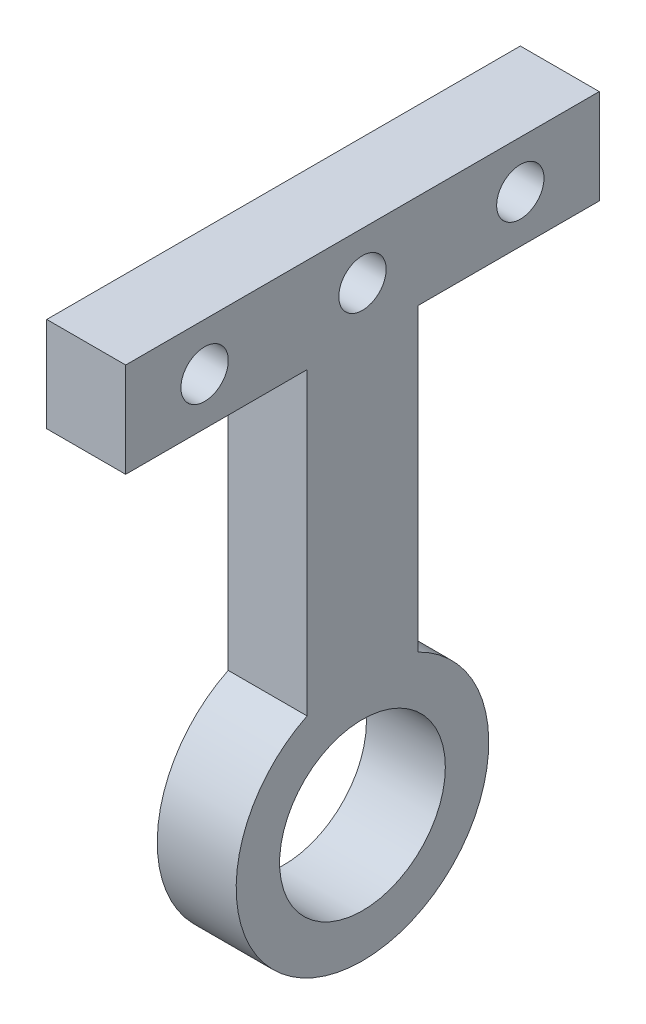
ISO-10303-21;
HEADER;
FILE_DESCRIPTION(('STEP AP214'),'2;1');
FILE_NAME('part.step','',(''),(''),'','','');
FILE_SCHEMA(('AUTOMOTIVE_DESIGN { 1 0 10303 214 1 1 1 1 }'));
ENDSEC;
DATA;
#1=APPLICATION_CONTEXT('core data for automotive mechanical design processes');
#2=APPLICATION_PROTOCOL_DEFINITION('international standard','automotive_design',2000,#1);
#3=PRODUCT_CONTEXT('',#1,'mechanical');
#4=PRODUCT('Part','Part','',(#3));
#5=PRODUCT_RELATED_PRODUCT_CATEGORY('part','',(#4));
#6=PRODUCT_DEFINITION_FORMATION('','',#4);
#7=PRODUCT_DEFINITION_CONTEXT('part definition',#1,'design');
#8=PRODUCT_DEFINITION('design','',#6,#7);
#9=PRODUCT_DEFINITION_SHAPE('','',#8);
#10=(LENGTH_UNIT() NAMED_UNIT(*) SI_UNIT(.MILLI.,.METRE.));
#11=(NAMED_UNIT(*) PLANE_ANGLE_UNIT() SI_UNIT($,.RADIAN.));
#12=(NAMED_UNIT(*) SI_UNIT($,.STERADIAN.) SOLID_ANGLE_UNIT());
#13=UNCERTAINTY_MEASURE_WITH_UNIT(LENGTH_MEASURE(1.E-05),#10,'distance_accuracy_value','');
#14=(GEOMETRIC_REPRESENTATION_CONTEXT(3) GLOBAL_UNCERTAINTY_ASSIGNED_CONTEXT((#13)) GLOBAL_UNIT_ASSIGNED_CONTEXT((#10,
#11,#12)) REPRESENTATION_CONTEXT('',''));
#15=CARTESIAN_POINT('',(0.,0.,0.));
#16=DIRECTION('',(0.,0.,1.));
#17=DIRECTION('',(1.,0.,0.));
#18=AXIS2_PLACEMENT_3D('',#15,#16,#17);
#19=CARTESIAN_POINT('',(5.,7.19055956479205,3.50654433098706));
#20=DIRECTION('',(0.,0.,-1.));
#21=DIRECTION('',(-1.,0.,0.));
#22=AXIS2_PLACEMENT_3D('',#19,#20,#21);
#23=PLANE('',#22);
#24=DIRECTION('',(0.,-1.,0.));
#25=VECTOR('',#24,1.);
#26=CARTESIAN_POINT('',(5.,7.19055956479205,3.50654433098706));
#27=LINE('',#26,#25);
#28=CARTESIAN_POINT('',(5.,26.190559564792,3.50654433098706));
#29=VERTEX_POINT('',#28);
#30=CARTESIAN_POINT('',(5.,7.19055956479205,3.50654433098706));
#31=VERTEX_POINT('',#30);
#32=EDGE_CURVE('E106',#29,#31,#27,.T.);
#33=ORIENTED_EDGE('',*,*,#32,.F.);
#34=DIRECTION('',(-1.,0.,0.));
#35=VECTOR('',#34,1.);
#36=CARTESIAN_POINT('',(5.,26.190559564792,3.50654433098706));
#37=LINE('',#36,#35);
#38=CARTESIAN_POINT('',(0.,26.190559564792,3.50654433098706));
#39=VERTEX_POINT('',#38);
#40=EDGE_CURVE('E125',#29,#39,#37,.T.);
#41=ORIENTED_EDGE('',*,*,#40,.T.);
#42=DIRECTION('',(0.,-1.,0.));
#43=VECTOR('',#42,1.);
#44=CARTESIAN_POINT('',(0.,7.19055956479205,3.50654433098706));
#45=LINE('',#44,#43);
#46=CARTESIAN_POINT('',(0.,7.19055956479205,3.50654433098706));
#47=VERTEX_POINT('',#46);
#48=EDGE_CURVE('E87',#39,#47,#45,.T.);
#49=ORIENTED_EDGE('',*,*,#48,.T.);
#50=DIRECTION('',(-1.,0.,0.));
#51=VECTOR('',#50,1.);
#52=CARTESIAN_POINT('',(5.,7.19055956479205,3.50654433098706));
#53=LINE('',#52,#51);
#54=EDGE_CURVE('E11',#31,#47,#53,.T.);
#55=ORIENTED_EDGE('',*,*,#54,.F.);
#56=EDGE_LOOP('',(#33,#41,#49,#55));
#57=FACE_BOUND('',#56,.T.);
#58=ADVANCED_FACE('F43',(#57),#23,.F.);
#59=CARTESIAN_POINT('',(5.,0.,0.));
#60=DIRECTION('',(-1.,0.,0.));
#61=DIRECTION('',(0.,0.,1.));
#62=AXIS2_PLACEMENT_3D('',#59,#60,#61);
#63=CYLINDRICAL_SURFACE('',#62,8.);
#64=CARTESIAN_POINT('',(0.,0.,0.));
#65=DIRECTION('',(1.,0.,0.));
#66=DIRECTION('',(0.,0.,-1.));
#67=AXIS2_PLACEMENT_3D('',#64,#65,#66);
#68=CIRCLE('',#67,8.);
#69=CARTESIAN_POINT('',(0.,7.19055956479205,-3.50654433098706));
#70=VERTEX_POINT('',#69);
#71=EDGE_CURVE('E77',#47,#70,#68,.T.);
#72=ORIENTED_EDGE('',*,*,#71,.T.);
#73=DIRECTION('',(-1.,0.,0.));
#74=VECTOR('',#73,1.);
#75=CARTESIAN_POINT('',(5.,7.19055956479205,-3.50654433098706));
#76=LINE('',#75,#74);
#77=CARTESIAN_POINT('',(5.,7.19055956479205,-3.50654433098706));
#78=VERTEX_POINT('',#77);
#79=EDGE_CURVE('E51',#78,#70,#76,.T.);
#80=ORIENTED_EDGE('',*,*,#79,.F.);
#81=CARTESIAN_POINT('',(5.,0.,0.));
#82=DIRECTION('',(1.,0.,0.));
#83=DIRECTION('',(0.,0.,-1.));
#84=AXIS2_PLACEMENT_3D('',#81,#82,#83);
#85=CIRCLE('',#84,8.);
#86=EDGE_CURVE('E65',#31,#78,#85,.T.);
#87=ORIENTED_EDGE('',*,*,#86,.F.);
#88=ORIENTED_EDGE('',*,*,#54,.T.);
#89=EDGE_LOOP('',(#72,#80,#87,#88));
#90=FACE_BOUND('',#89,.T.);
#91=ADVANCED_FACE('F79',(#90),#63,.T.);
#92=CARTESIAN_POINT('',(5.,7.19055956479205,-3.50654433098706));
#93=DIRECTION('',(0.,0.,1.));
#94=DIRECTION('',(1.,0.,0.));
#95=AXIS2_PLACEMENT_3D('',#92,#93,#94);
#96=PLANE('',#95);
#97=DIRECTION('',(0.,1.,0.));
#98=VECTOR('',#97,1.);
#99=CARTESIAN_POINT('',(0.,7.19055956479205,-3.50654433098706));
#100=LINE('',#99,#98);
#101=CARTESIAN_POINT('',(0.,26.190559564792,-3.50654433098706));
#102=VERTEX_POINT('',#101);
#103=EDGE_CURVE('E86',#70,#102,#100,.T.);
#104=ORIENTED_EDGE('',*,*,#103,.T.);
#105=DIRECTION('',(1.,0.,0.));
#106=VECTOR('',#105,1.);
#107=CARTESIAN_POINT('',(5.,26.190559564792,-3.50654433098706));
#108=LINE('',#107,#106);
#109=CARTESIAN_POINT('',(5.,26.190559564792,-3.50654433098706));
#110=VERTEX_POINT('',#109);
#111=EDGE_CURVE('E132',#102,#110,#108,.T.);
#112=ORIENTED_EDGE('',*,*,#111,.T.);
#113=DIRECTION('',(0.,1.,0.));
#114=VECTOR('',#113,1.);
#115=CARTESIAN_POINT('',(5.,7.19055956479205,-3.50654433098706));
#116=LINE('',#115,#114);
#117=EDGE_CURVE('E93',#78,#110,#116,.T.);
#118=ORIENTED_EDGE('',*,*,#117,.F.);
#119=ORIENTED_EDGE('',*,*,#79,.T.);
#120=EDGE_LOOP('',(#104,#112,#118,#119));
#121=FACE_BOUND('',#120,.T.);
#122=ADVANCED_FACE('F91',(#121),#96,.F.);
#123=CARTESIAN_POINT('',(5.,32.1905595647921,-3.50654433098706));
#124=DIRECTION('',(0.,-1.,0.));
#125=DIRECTION('',(0.,0.,-1.));
#126=AXIS2_PLACEMENT_3D('',#123,#124,#125);
#127=PLANE('',#126);
#128=DIRECTION('',(0.,0.,1.));
#129=VECTOR('',#128,1.);
#130=CARTESIAN_POINT('',(0.,32.1905595647921,-3.50654433098706));
#131=LINE('',#130,#129);
#132=CARTESIAN_POINT('',(0.,32.190559564792,-15.));
#133=VERTEX_POINT('',#132);
#134=CARTESIAN_POINT('',(0.,32.190559564792,15.));
#135=VERTEX_POINT('',#134);
#136=EDGE_CURVE('E102',#133,#135,#131,.T.);
#137=ORIENTED_EDGE('',*,*,#136,.T.);
#138=DIRECTION('',(1.,0.,0.));
#139=VECTOR('',#138,1.);
#140=CARTESIAN_POINT('',(0.,32.190559564792,15.));
#141=LINE('',#140,#139);
#142=CARTESIAN_POINT('',(5.,32.190559564792,15.));
#143=VERTEX_POINT('',#142);
#144=EDGE_CURVE('E136',#135,#143,#141,.T.);
#145=ORIENTED_EDGE('',*,*,#144,.T.);
#146=DIRECTION('',(0.,0.,1.));
#147=VECTOR('',#146,1.);
#148=CARTESIAN_POINT('',(5.,32.1905595647921,-3.50654433098706));
#149=LINE('',#148,#147);
#150=CARTESIAN_POINT('',(5.,32.190559564792,-15.));
#151=VERTEX_POINT('',#150);
#152=EDGE_CURVE('E95',#151,#143,#149,.T.);
#153=ORIENTED_EDGE('',*,*,#152,.F.);
#154=DIRECTION('',(1.,0.,0.));
#155=VECTOR('',#154,1.);
#156=CARTESIAN_POINT('',(0.,32.190559564792,-15.));
#157=LINE('',#156,#155);
#158=EDGE_CURVE('E135',#133,#151,#157,.T.);
#159=ORIENTED_EDGE('',*,*,#158,.F.);
#160=EDGE_LOOP('',(#137,#145,#153,#159));
#161=FACE_BOUND('',#160,.T.);
#162=ADVANCED_FACE('F217',(#161),#127,.F.);
#163=CARTESIAN_POINT('',(5.,0.,0.));
#164=DIRECTION('',(1.,0.,0.));
#165=DIRECTION('',(0.,0.,-1.));
#166=AXIS2_PLACEMENT_3D('',#163,#164,#165);
#167=PLANE('',#166);
#168=CARTESIAN_POINT('',(5.,29.190559564792,10.));
#169=DIRECTION('',(-1.,0.,0.));
#170=DIRECTION('',(0.,0.,1.));
#171=AXIS2_PLACEMENT_3D('',#168,#169,#170);
#172=CIRCLE('',#171,1.5);
#173=CARTESIAN_POINT('',(5.,29.190559564792,11.5));
#174=VERTEX_POINT('',#173);
#175=EDGE_CURVE('E182',#174,#174,#172,.T.);
#176=ORIENTED_EDGE('',*,*,#175,.T.);
#177=EDGE_LOOP('',(#176));
#178=FACE_BOUND('',#177,.T.);
#179=CARTESIAN_POINT('',(5.,29.190559564792,-10.));
#180=DIRECTION('',(-1.,0.,0.));
#181=DIRECTION('',(0.,0.,1.));
#182=AXIS2_PLACEMENT_3D('',#179,#180,#181);
#183=CIRCLE('',#182,1.5);
#184=CARTESIAN_POINT('',(5.,29.190559564792,-8.5));
#185=VERTEX_POINT('',#184);
#186=EDGE_CURVE('E190',#185,#185,#183,.T.);
#187=ORIENTED_EDGE('',*,*,#186,.T.);
#188=EDGE_LOOP('',(#187));
#189=FACE_BOUND('',#188,.T.);
#190=CARTESIAN_POINT('',(5.,29.190559564792,0.));
#191=DIRECTION('',(-1.,0.,0.));
#192=DIRECTION('',(0.,0.,1.));
#193=AXIS2_PLACEMENT_3D('',#190,#191,#192);
#194=CIRCLE('',#193,1.5);
#195=CARTESIAN_POINT('',(5.,29.190559564792,1.5));
#196=VERTEX_POINT('',#195);
#197=EDGE_CURVE('E163',#196,#196,#194,.T.);
#198=ORIENTED_EDGE('',*,*,#197,.T.);
#199=EDGE_LOOP('',(#198));
#200=FACE_BOUND('',#199,.T.);
#201=ORIENTED_EDGE('',*,*,#117,.T.);
#202=DIRECTION('',(0.,0.,-1.));
#203=VECTOR('',#202,1.);
#204=CARTESIAN_POINT('',(5.,26.190559564792,-15.));
#205=LINE('',#204,#203);
#206=CARTESIAN_POINT('',(5.,26.190559564792,-15.));
#207=VERTEX_POINT('',#206);
#208=EDGE_CURVE('E159',#110,#207,#205,.T.);
#209=ORIENTED_EDGE('',*,*,#208,.T.);
#210=DIRECTION('',(0.,1.,0.));
#211=VECTOR('',#210,1.);
#212=CARTESIAN_POINT('',(5.,32.190559564792,-15.));
#213=LINE('',#212,#211);
#214=EDGE_CURVE('E152',#207,#151,#213,.T.);
#215=ORIENTED_EDGE('',*,*,#214,.T.);
#216=ORIENTED_EDGE('',*,*,#152,.T.);
#217=DIRECTION('',(0.,-1.,0.));
#218=VECTOR('',#217,1.);
#219=CARTESIAN_POINT('',(5.,26.190559564792,15.));
#220=LINE('',#219,#218);
#221=CARTESIAN_POINT('',(5.,26.190559564792,15.));
#222=VERTEX_POINT('',#221);
#223=EDGE_CURVE('E160',#143,#222,#220,.T.);
#224=ORIENTED_EDGE('',*,*,#223,.T.);
#225=EDGE_CURVE('E58',#222,#29,#205,.T.);
#226=ORIENTED_EDGE('',*,*,#225,.T.);
#227=ORIENTED_EDGE('',*,*,#32,.T.);
#228=ORIENTED_EDGE('',*,*,#86,.T.);
#229=EDGE_LOOP('',(#201,#209,#215,#216,#224,#226,#227,#228));
#230=FACE_BOUND('',#229,.T.);
#231=CARTESIAN_POINT('',(5.,0.,0.));
#232=DIRECTION('',(1.,0.,0.));
#233=DIRECTION('',(0.,0.,-1.));
#234=AXIS2_PLACEMENT_3D('',#231,#232,#233);
#235=CIRCLE('',#234,5.25);
#236=CARTESIAN_POINT('',(5.,0.,-5.25));
#237=VERTEX_POINT('',#236);
#238=EDGE_CURVE('E121',#237,#237,#235,.T.);
#239=ORIENTED_EDGE('',*,*,#238,.F.);
#240=EDGE_LOOP('',(#239));
#241=FACE_BOUND('',#240,.T.);
#242=ADVANCED_FACE('F203',(#178,#189,#200,#230,#241),#167,.T.);
#243=CARTESIAN_POINT('',(0.,0.,0.));
#244=DIRECTION('',(1.,0.,0.));
#245=DIRECTION('',(0.,0.,-1.));
#246=AXIS2_PLACEMENT_3D('',#243,#244,#245);
#247=PLANE('',#246);
#248=CARTESIAN_POINT('',(0.,29.190559564792,10.));
#249=DIRECTION('',(-1.,0.,0.));
#250=DIRECTION('',(0.,0.,1.));
#251=AXIS2_PLACEMENT_3D('',#248,#249,#250);
#252=CIRCLE('',#251,1.5);
#253=CARTESIAN_POINT('',(0.,29.190559564792,11.5));
#254=VERTEX_POINT('',#253);
#255=EDGE_CURVE('E186',#254,#254,#252,.T.);
#256=ORIENTED_EDGE('',*,*,#255,.F.);
#257=EDGE_LOOP('',(#256));
#258=FACE_BOUND('',#257,.T.);
#259=CARTESIAN_POINT('',(0.,29.190559564792,-10.));
#260=DIRECTION('',(-1.,0.,0.));
#261=DIRECTION('',(0.,0.,1.));
#262=AXIS2_PLACEMENT_3D('',#259,#260,#261);
#263=CIRCLE('',#262,1.5);
#264=CARTESIAN_POINT('',(0.,29.190559564792,-8.5));
#265=VERTEX_POINT('',#264);
#266=EDGE_CURVE('E178',#265,#265,#263,.T.);
#267=ORIENTED_EDGE('',*,*,#266,.F.);
#268=EDGE_LOOP('',(#267));
#269=FACE_BOUND('',#268,.T.);
#270=CARTESIAN_POINT('',(0.,29.190559564792,0.));
#271=DIRECTION('',(-1.,0.,0.));
#272=DIRECTION('',(0.,0.,1.));
#273=AXIS2_PLACEMENT_3D('',#270,#271,#272);
#274=CIRCLE('',#273,1.5);
#275=CARTESIAN_POINT('',(0.,29.190559564792,1.5));
#276=VERTEX_POINT('',#275);
#277=EDGE_CURVE('E174',#276,#276,#274,.T.);
#278=ORIENTED_EDGE('',*,*,#277,.F.);
#279=EDGE_LOOP('',(#278));
#280=FACE_BOUND('',#279,.T.);
#281=CARTESIAN_POINT('',(0.,0.,0.));
#282=DIRECTION('',(1.,0.,0.));
#283=DIRECTION('',(0.,0.,-1.));
#284=AXIS2_PLACEMENT_3D('',#281,#282,#283);
#285=CIRCLE('',#284,5.25);
#286=CARTESIAN_POINT('',(0.,0.,-5.25));
#287=VERTEX_POINT('',#286);
#288=EDGE_CURVE('E111',#287,#287,#285,.T.);
#289=ORIENTED_EDGE('',*,*,#288,.T.);
#290=EDGE_LOOP('',(#289));
#291=FACE_BOUND('',#290,.T.);
#292=ORIENTED_EDGE('',*,*,#48,.F.);
#293=DIRECTION('',(0.,0.,-1.));
#294=VECTOR('',#293,1.);
#295=CARTESIAN_POINT('',(0.,26.190559564792,-15.));
#296=LINE('',#295,#294);
#297=CARTESIAN_POINT('',(0.,26.190559564792,15.));
#298=VERTEX_POINT('',#297);
#299=EDGE_CURVE('E167',#298,#39,#296,.T.);
#300=ORIENTED_EDGE('',*,*,#299,.F.);
#301=DIRECTION('',(0.,-1.,0.));
#302=VECTOR('',#301,1.);
#303=CARTESIAN_POINT('',(0.,26.190559564792,15.));
#304=LINE('',#303,#302);
#305=EDGE_CURVE('E156',#135,#298,#304,.T.);
#306=ORIENTED_EDGE('',*,*,#305,.F.);
#307=ORIENTED_EDGE('',*,*,#136,.F.);
#308=DIRECTION('',(0.,1.,0.));
#309=VECTOR('',#308,1.);
#310=CARTESIAN_POINT('',(0.,32.190559564792,-15.));
#311=LINE('',#310,#309);
#312=CARTESIAN_POINT('',(0.,26.190559564792,-15.));
#313=VERTEX_POINT('',#312);
#314=EDGE_CURVE('E141',#313,#133,#311,.T.);
#315=ORIENTED_EDGE('',*,*,#314,.F.);
#316=EDGE_CURVE('E100',#102,#313,#296,.T.);
#317=ORIENTED_EDGE('',*,*,#316,.F.);
#318=ORIENTED_EDGE('',*,*,#103,.F.);
#319=ORIENTED_EDGE('',*,*,#71,.F.);
#320=EDGE_LOOP('',(#292,#300,#306,#307,#315,#317,#318,#319));
#321=FACE_BOUND('',#320,.T.);
#322=ADVANCED_FACE('F97',(#258,#269,#280,#291,#321),#247,.F.);
#323=CARTESIAN_POINT('',(0.,0.,0.));
#324=DIRECTION('',(1.,0.,0.));
#325=DIRECTION('',(0.,0.,-1.));
#326=AXIS2_PLACEMENT_3D('',#323,#324,#325);
#327=CYLINDRICAL_SURFACE('',#326,5.25);
#328=ORIENTED_EDGE('',*,*,#288,.F.);
#329=EDGE_LOOP('',(#328));
#330=FACE_BOUND('',#329,.T.);
#331=ORIENTED_EDGE('',*,*,#238,.T.);
#332=EDGE_LOOP('',(#331));
#333=FACE_BOUND('',#332,.T.);
#334=ADVANCED_FACE('F202',(#330,#333),#327,.F.);
#335=CARTESIAN_POINT('',(0.,32.190559564792,-15.));
#336=DIRECTION('',(0.,0.,-1.));
#337=DIRECTION('',(-1.,0.,0.));
#338=AXIS2_PLACEMENT_3D('',#335,#336,#337);
#339=PLANE('',#338);
#340=ORIENTED_EDGE('',*,*,#214,.F.);
#341=DIRECTION('',(1.,0.,0.));
#342=VECTOR('',#341,1.);
#343=CARTESIAN_POINT('',(0.,26.190559564792,-15.));
#344=LINE('',#343,#342);
#345=EDGE_CURVE('E145',#313,#207,#344,.T.);
#346=ORIENTED_EDGE('',*,*,#345,.F.);
#347=ORIENTED_EDGE('',*,*,#314,.T.);
#348=ORIENTED_EDGE('',*,*,#158,.T.);
#349=EDGE_LOOP('',(#340,#346,#347,#348));
#350=FACE_BOUND('',#349,.T.);
#351=ADVANCED_FACE('F212',(#350),#339,.T.);
#352=CARTESIAN_POINT('',(0.,26.190559564792,-15.));
#353=DIRECTION('',(0.,-1.,0.));
#354=DIRECTION('',(0.,0.,-1.));
#355=AXIS2_PLACEMENT_3D('',#352,#353,#354);
#356=PLANE('',#355);
#357=ORIENTED_EDGE('',*,*,#111,.F.);
#358=ORIENTED_EDGE('',*,*,#316,.T.);
#359=ORIENTED_EDGE('',*,*,#345,.T.);
#360=ORIENTED_EDGE('',*,*,#208,.F.);
#361=EDGE_LOOP('',(#357,#358,#359,#360));
#362=FACE_BOUND('',#361,.T.);
#363=ADVANCED_FACE('F248',(#362),#356,.T.);
#364=ORIENTED_EDGE('',*,*,#40,.F.);
#365=ORIENTED_EDGE('',*,*,#225,.F.);
#366=DIRECTION('',(1.,0.,0.));
#367=VECTOR('',#366,1.);
#368=CARTESIAN_POINT('',(0.,26.190559564792,15.));
#369=LINE('',#368,#367);
#370=EDGE_CURVE('E140',#298,#222,#369,.T.);
#371=ORIENTED_EDGE('',*,*,#370,.F.);
#372=ORIENTED_EDGE('',*,*,#299,.T.);
#373=EDGE_LOOP('',(#364,#365,#371,#372));
#374=FACE_BOUND('',#373,.T.);
#375=ADVANCED_FACE('F270',(#374),#356,.T.);
#376=CARTESIAN_POINT('',(0.,26.190559564792,15.));
#377=DIRECTION('',(0.,0.,1.));
#378=DIRECTION('',(1.,0.,0.));
#379=AXIS2_PLACEMENT_3D('',#376,#377,#378);
#380=PLANE('',#379);
#381=ORIENTED_EDGE('',*,*,#223,.F.);
#382=ORIENTED_EDGE('',*,*,#144,.F.);
#383=ORIENTED_EDGE('',*,*,#305,.T.);
#384=ORIENTED_EDGE('',*,*,#370,.T.);
#385=EDGE_LOOP('',(#381,#382,#383,#384));
#386=FACE_BOUND('',#385,.T.);
#387=ADVANCED_FACE('F266',(#386),#380,.T.);
#388=CARTESIAN_POINT('',(5.,29.190559564792,0.));
#389=DIRECTION('',(-1.,0.,0.));
#390=DIRECTION('',(0.,0.,1.));
#391=AXIS2_PLACEMENT_3D('',#388,#389,#390);
#392=CYLINDRICAL_SURFACE('',#391,1.5);
#393=ORIENTED_EDGE('',*,*,#197,.F.);
#394=EDGE_LOOP('',(#393));
#395=FACE_BOUND('',#394,.T.);
#396=ORIENTED_EDGE('',*,*,#277,.T.);
#397=EDGE_LOOP('',(#396));
#398=FACE_BOUND('',#397,.T.);
#399=ADVANCED_FACE('F279',(#395,#398),#392,.F.);
#400=CARTESIAN_POINT('',(5.,29.190559564792,-10.));
#401=DIRECTION('',(-1.,0.,0.));
#402=DIRECTION('',(0.,0.,1.));
#403=AXIS2_PLACEMENT_3D('',#400,#401,#402);
#404=CYLINDRICAL_SURFACE('',#403,1.5);
#405=ORIENTED_EDGE('',*,*,#186,.F.);
#406=EDGE_LOOP('',(#405));
#407=FACE_BOUND('',#406,.T.);
#408=ORIENTED_EDGE('',*,*,#266,.T.);
#409=EDGE_LOOP('',(#408));
#410=FACE_BOUND('',#409,.T.);
#411=ADVANCED_FACE('F198',(#407,#410),#404,.F.);
#412=CARTESIAN_POINT('',(5.,29.190559564792,10.));
#413=DIRECTION('',(-1.,0.,0.));
#414=DIRECTION('',(0.,0.,1.));
#415=AXIS2_PLACEMENT_3D('',#412,#413,#414);
#416=CYLINDRICAL_SURFACE('',#415,1.5);
#417=ORIENTED_EDGE('',*,*,#175,.F.);
#418=EDGE_LOOP('',(#417));
#419=FACE_BOUND('',#418,.T.);
#420=ORIENTED_EDGE('',*,*,#255,.T.);
#421=EDGE_LOOP('',(#420));
#422=FACE_BOUND('',#421,.T.);
#423=ADVANCED_FACE('F287',(#419,#422),#416,.F.);
#424=CLOSED_SHELL('',(#58,#91,#122,#162,#242,#322,#334,#351,#363,#375,#387,#399,#411,#423));
#425=MANIFOLD_SOLID_BREP('B2',#424);
#426=ADVANCED_BREP_SHAPE_REPRESENTATION('',(#18,#425),#14);
#427=SHAPE_DEFINITION_REPRESENTATION(#9,#426);
ENDSEC;
END-ISO-10303-21;
